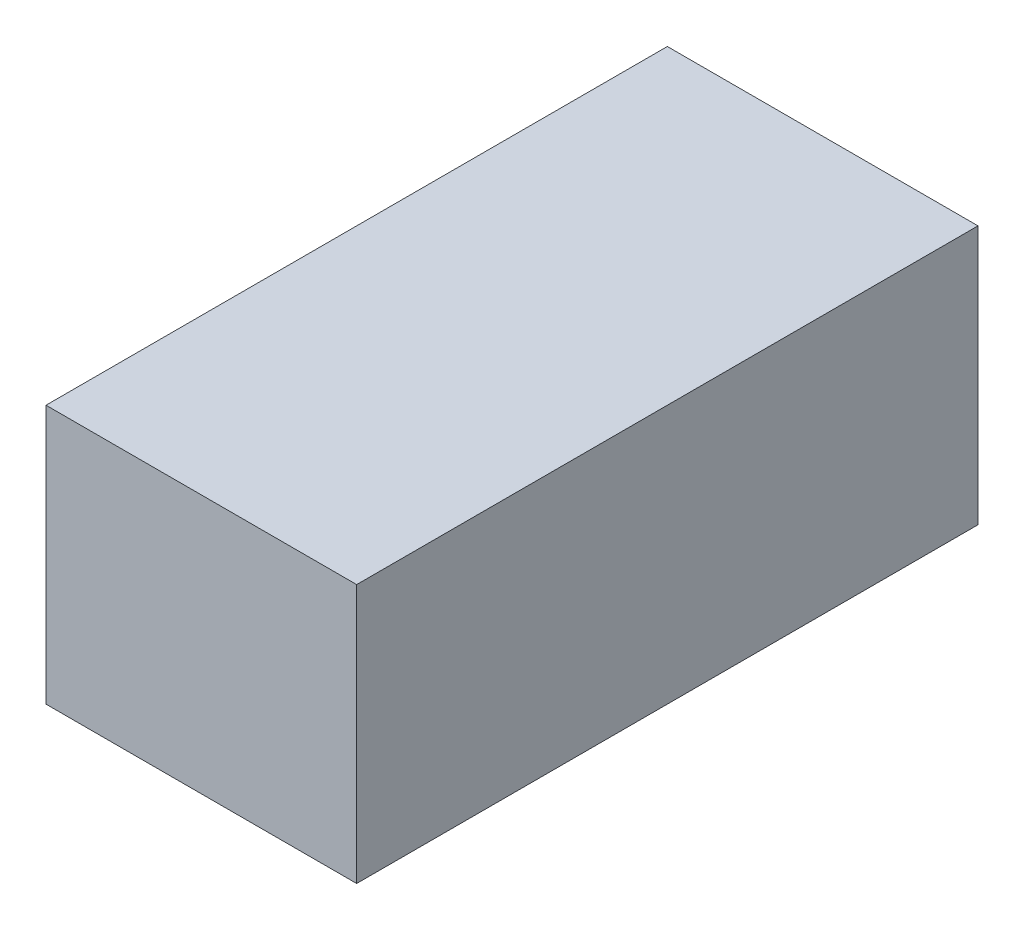
ISO-10303-21;
HEADER;
FILE_DESCRIPTION(('STEP AP214'),'2;1');
FILE_NAME('part.step','',(''),(''),'','','');
FILE_SCHEMA(('AUTOMOTIVE_DESIGN { 1 0 10303 214 1 1 1 1 }'));
ENDSEC;
DATA;
#1=APPLICATION_CONTEXT('core data for automotive mechanical design processes');
#2=APPLICATION_PROTOCOL_DEFINITION('international standard','automotive_design',2000,#1);
#3=PRODUCT_CONTEXT('',#1,'mechanical');
#4=PRODUCT('Part','Part','',(#3));
#5=PRODUCT_RELATED_PRODUCT_CATEGORY('part','',(#4));
#6=PRODUCT_DEFINITION_FORMATION('','',#4);
#7=PRODUCT_DEFINITION_CONTEXT('part definition',#1,'design');
#8=PRODUCT_DEFINITION('design','',#6,#7);
#9=PRODUCT_DEFINITION_SHAPE('','',#8);
#10=(LENGTH_UNIT() NAMED_UNIT(*) SI_UNIT(.MILLI.,.METRE.));
#11=(NAMED_UNIT(*) PLANE_ANGLE_UNIT() SI_UNIT($,.RADIAN.));
#12=(NAMED_UNIT(*) SI_UNIT($,.STERADIAN.) SOLID_ANGLE_UNIT());
#13=UNCERTAINTY_MEASURE_WITH_UNIT(LENGTH_MEASURE(1.E-05),#10,'distance_accuracy_value','');
#14=(GEOMETRIC_REPRESENTATION_CONTEXT(3) GLOBAL_UNCERTAINTY_ASSIGNED_CONTEXT((#13)) GLOBAL_UNIT_ASSIGNED_CONTEXT((#10,
#11,#12)) REPRESENTATION_CONTEXT('',''));
#15=CARTESIAN_POINT('',(0.,0.,0.));
#16=DIRECTION('',(0.,0.,1.));
#17=DIRECTION('',(1.,0.,0.));
#18=AXIS2_PLACEMENT_3D('',#15,#16,#17);
#19=CARTESIAN_POINT('',(-19.05,31.75,-76.2));
#20=DIRECTION('',(1.,0.,0.));
#21=DIRECTION('',(0.,0.,-1.));
#22=AXIS2_PLACEMENT_3D('',#19,#20,#21);
#23=PLANE('',#22);
#24=DIRECTION('',(0.,0.,1.));
#25=VECTOR('',#24,1.);
#26=CARTESIAN_POINT('',(-19.05,0.,-76.2));
#27=LINE('',#26,#25);
#28=CARTESIAN_POINT('',(-19.05,0.,-76.2));
#29=VERTEX_POINT('',#28);
#30=CARTESIAN_POINT('',(-19.05,0.,0.));
#31=VERTEX_POINT('',#30);
#32=EDGE_CURVE('E74',#29,#31,#27,.T.);
#33=ORIENTED_EDGE('',*,*,#32,.T.);
#34=DIRECTION('',(0.,-1.,0.));
#35=VECTOR('',#34,1.);
#36=CARTESIAN_POINT('',(-19.05,31.75,0.));
#37=LINE('',#36,#35);
#38=CARTESIAN_POINT('',(-19.05,31.75,0.));
#39=VERTEX_POINT('',#38);
#40=EDGE_CURVE('E11',#39,#31,#37,.T.);
#41=ORIENTED_EDGE('',*,*,#40,.F.);
#42=DIRECTION('',(0.,0.,1.));
#43=VECTOR('',#42,1.);
#44=CARTESIAN_POINT('',(-19.05,31.75,-76.2));
#45=LINE('',#44,#43);
#46=CARTESIAN_POINT('',(-19.05,31.75,-76.2));
#47=VERTEX_POINT('',#46);
#48=EDGE_CURVE('E92',#47,#39,#45,.T.);
#49=ORIENTED_EDGE('',*,*,#48,.F.);
#50=DIRECTION('',(0.,-1.,0.));
#51=VECTOR('',#50,1.);
#52=CARTESIAN_POINT('',(-19.05,31.75,-76.2));
#53=LINE('',#52,#51);
#54=EDGE_CURVE('E86',#47,#29,#53,.T.);
#55=ORIENTED_EDGE('',*,*,#54,.T.);
#56=EDGE_LOOP('',(#33,#41,#49,#55));
#57=FACE_BOUND('',#56,.T.);
#58=ADVANCED_FACE('F30',(#57),#23,.F.);
#59=CARTESIAN_POINT('',(-19.05,31.75,0.));
#60=DIRECTION('',(0.,0.,-1.));
#61=DIRECTION('',(-1.,0.,0.));
#62=AXIS2_PLACEMENT_3D('',#59,#60,#61);
#63=PLANE('',#62);
#64=DIRECTION('',(1.,0.,0.));
#65=VECTOR('',#64,1.);
#66=CARTESIAN_POINT('',(-19.05,0.,0.));
#67=LINE('',#66,#65);
#68=CARTESIAN_POINT('',(19.05,0.,0.));
#69=VERTEX_POINT('',#68);
#70=EDGE_CURVE('E70',#31,#69,#67,.T.);
#71=ORIENTED_EDGE('',*,*,#70,.T.);
#72=DIRECTION('',(0.,-1.,0.));
#73=VECTOR('',#72,1.);
#74=CARTESIAN_POINT('',(19.05,31.75,0.));
#75=LINE('',#74,#73);
#76=CARTESIAN_POINT('',(19.05,31.75,0.));
#77=VERTEX_POINT('',#76);
#78=EDGE_CURVE('E37',#77,#69,#75,.T.);
#79=ORIENTED_EDGE('',*,*,#78,.F.);
#80=DIRECTION('',(1.,0.,0.));
#81=VECTOR('',#80,1.);
#82=CARTESIAN_POINT('',(-19.05,31.75,0.));
#83=LINE('',#82,#81);
#84=EDGE_CURVE('E82',#39,#77,#83,.T.);
#85=ORIENTED_EDGE('',*,*,#84,.F.);
#86=ORIENTED_EDGE('',*,*,#40,.T.);
#87=EDGE_LOOP('',(#71,#79,#85,#86));
#88=FACE_BOUND('',#87,.T.);
#89=ADVANCED_FACE('F81',(#88),#63,.F.);
#90=CARTESIAN_POINT('',(19.05,31.75,0.));
#91=DIRECTION('',(-1.,0.,0.));
#92=DIRECTION('',(0.,0.,1.));
#93=AXIS2_PLACEMENT_3D('',#90,#91,#92);
#94=PLANE('',#93);
#95=DIRECTION('',(0.,0.,-1.));
#96=VECTOR('',#95,1.);
#97=CARTESIAN_POINT('',(19.05,0.,0.));
#98=LINE('',#97,#96);
#99=CARTESIAN_POINT('',(19.05,0.,-76.2));
#100=VERTEX_POINT('',#99);
#101=EDGE_CURVE('E75',#69,#100,#98,.T.);
#102=ORIENTED_EDGE('',*,*,#101,.T.);
#103=DIRECTION('',(0.,-1.,0.));
#104=VECTOR('',#103,1.);
#105=CARTESIAN_POINT('',(19.05,31.75,-76.2));
#106=LINE('',#105,#104);
#107=CARTESIAN_POINT('',(19.05,31.75,-76.2));
#108=VERTEX_POINT('',#107);
#109=EDGE_CURVE('E98',#108,#100,#106,.T.);
#110=ORIENTED_EDGE('',*,*,#109,.F.);
#111=DIRECTION('',(0.,0.,-1.));
#112=VECTOR('',#111,1.);
#113=CARTESIAN_POINT('',(19.05,31.75,0.));
#114=LINE('',#113,#112);
#115=EDGE_CURVE('E49',#77,#108,#114,.T.);
#116=ORIENTED_EDGE('',*,*,#115,.F.);
#117=ORIENTED_EDGE('',*,*,#78,.T.);
#118=EDGE_LOOP('',(#102,#110,#116,#117));
#119=FACE_BOUND('',#118,.T.);
#120=ADVANCED_FACE('F101',(#119),#94,.F.);
#121=CARTESIAN_POINT('',(19.05,31.75,-76.2));
#122=DIRECTION('',(0.,0.,1.));
#123=DIRECTION('',(1.,0.,0.));
#124=AXIS2_PLACEMENT_3D('',#121,#122,#123);
#125=PLANE('',#124);
#126=DIRECTION('',(-1.,0.,0.));
#127=VECTOR('',#126,1.);
#128=CARTESIAN_POINT('',(19.05,0.,-76.2));
#129=LINE('',#128,#127);
#130=EDGE_CURVE('E90',#100,#29,#129,.T.);
#131=ORIENTED_EDGE('',*,*,#130,.T.);
#132=ORIENTED_EDGE('',*,*,#54,.F.);
#133=DIRECTION('',(-1.,0.,0.));
#134=VECTOR('',#133,1.);
#135=CARTESIAN_POINT('',(19.05,31.75,-76.2));
#136=LINE('',#135,#134);
#137=EDGE_CURVE('E44',#108,#47,#136,.T.);
#138=ORIENTED_EDGE('',*,*,#137,.F.);
#139=ORIENTED_EDGE('',*,*,#109,.T.);
#140=EDGE_LOOP('',(#131,#132,#138,#139));
#141=FACE_BOUND('',#140,.T.);
#142=ADVANCED_FACE('F103',(#141),#125,.F.);
#143=CARTESIAN_POINT('',(-19.05,31.75,0.));
#144=DIRECTION('',(0.,1.,0.));
#145=DIRECTION('',(0.,0.,1.));
#146=AXIS2_PLACEMENT_3D('',#143,#144,#145);
#147=PLANE('',#146);
#148=ORIENTED_EDGE('',*,*,#48,.T.);
#149=ORIENTED_EDGE('',*,*,#84,.T.);
#150=ORIENTED_EDGE('',*,*,#115,.T.);
#151=ORIENTED_EDGE('',*,*,#137,.T.);
#152=EDGE_LOOP('',(#148,#149,#150,#151));
#153=FACE_BOUND('',#152,.T.);
#154=ADVANCED_FACE('F104',(#153),#147,.T.);
#155=CARTESIAN_POINT('',(-19.05,0.,0.));
#156=DIRECTION('',(0.,1.,0.));
#157=DIRECTION('',(0.,0.,1.));
#158=AXIS2_PLACEMENT_3D('',#155,#156,#157);
#159=PLANE('',#158);
#160=ORIENTED_EDGE('',*,*,#32,.F.);
#161=ORIENTED_EDGE('',*,*,#130,.F.);
#162=ORIENTED_EDGE('',*,*,#101,.F.);
#163=ORIENTED_EDGE('',*,*,#70,.F.);
#164=EDGE_LOOP('',(#160,#161,#162,#163));
#165=FACE_BOUND('',#164,.T.);
#166=ADVANCED_FACE('F71',(#165),#159,.F.);
#167=CLOSED_SHELL('',(#58,#89,#120,#142,#154,#166));
#168=MANIFOLD_SOLID_BREP('B2',#167);
#169=ADVANCED_BREP_SHAPE_REPRESENTATION('',(#18,#168),#14);
#170=SHAPE_DEFINITION_REPRESENTATION(#9,#169);
ENDSEC;
END-ISO-10303-21;
